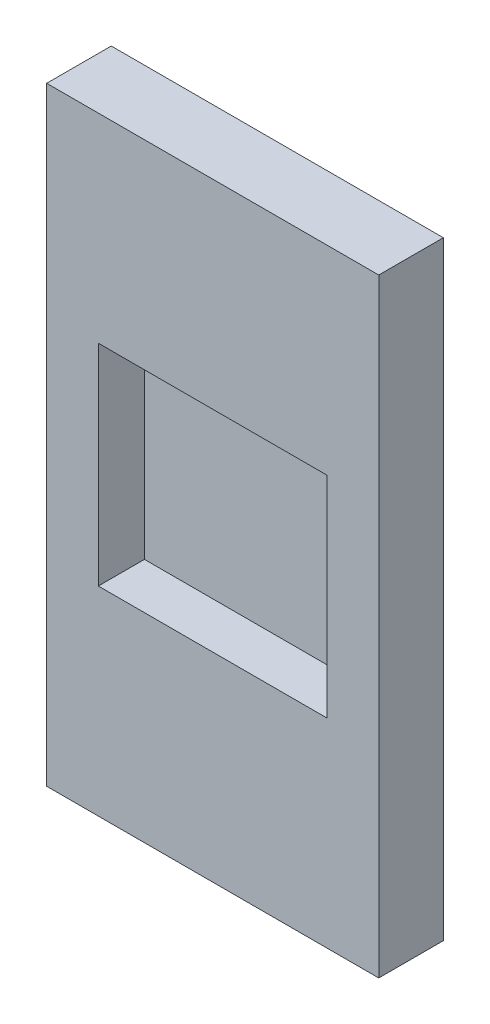
ISO-10303-21;
HEADER;
FILE_DESCRIPTION(('STEP AP214'),'2;1');
FILE_NAME('part.step','',(''),(''),'','','');
FILE_SCHEMA(('AUTOMOTIVE_DESIGN { 1 0 10303 214 1 1 1 1 }'));
ENDSEC;
DATA;
#1=APPLICATION_CONTEXT('core data for automotive mechanical design processes');
#2=APPLICATION_PROTOCOL_DEFINITION('international standard','automotive_design',2000,#1);
#3=PRODUCT_CONTEXT('',#1,'mechanical');
#4=PRODUCT('Part','Part','',(#3));
#5=PRODUCT_RELATED_PRODUCT_CATEGORY('part','',(#4));
#6=PRODUCT_DEFINITION_FORMATION('','',#4);
#7=PRODUCT_DEFINITION_CONTEXT('part definition',#1,'design');
#8=PRODUCT_DEFINITION('design','',#6,#7);
#9=PRODUCT_DEFINITION_SHAPE('','',#8);
#10=(LENGTH_UNIT() NAMED_UNIT(*) SI_UNIT(.MILLI.,.METRE.));
#11=(NAMED_UNIT(*) PLANE_ANGLE_UNIT() SI_UNIT($,.RADIAN.));
#12=(NAMED_UNIT(*) SI_UNIT($,.STERADIAN.) SOLID_ANGLE_UNIT());
#13=UNCERTAINTY_MEASURE_WITH_UNIT(LENGTH_MEASURE(1.E-05),#10,'distance_accuracy_value','');
#14=(GEOMETRIC_REPRESENTATION_CONTEXT(3) GLOBAL_UNCERTAINTY_ASSIGNED_CONTEXT((#13)) GLOBAL_UNIT_ASSIGNED_CONTEXT((#10,
#11,#12)) REPRESENTATION_CONTEXT('',''));
#15=CARTESIAN_POINT('',(0.,0.,0.));
#16=DIRECTION('',(0.,0.,1.));
#17=DIRECTION('',(1.,0.,0.));
#18=AXIS2_PLACEMENT_3D('',#15,#16,#17);
#19=CARTESIAN_POINT('',(9.,-16.5,3.5));
#20=DIRECTION('',(-1.,0.,0.));
#21=DIRECTION('',(0.,0.,1.));
#22=AXIS2_PLACEMENT_3D('',#19,#20,#21);
#23=PLANE('',#22);
#24=DIRECTION('',(0.,1.,0.));
#25=VECTOR('',#24,1.);
#26=CARTESIAN_POINT('',(9.,-16.5,0.));
#27=LINE('',#26,#25);
#28=CARTESIAN_POINT('',(9.,-16.5,0.));
#29=VERTEX_POINT('',#28);
#30=CARTESIAN_POINT('',(9.,16.5,0.));
#31=VERTEX_POINT('',#30);
#32=EDGE_CURVE('E158',#29,#31,#27,.T.);
#33=ORIENTED_EDGE('',*,*,#32,.T.);
#34=DIRECTION('',(0.,0.,-1.));
#35=VECTOR('',#34,1.);
#36=CARTESIAN_POINT('',(9.,16.5,3.5));
#37=LINE('',#36,#35);
#38=CARTESIAN_POINT('',(9.,16.5,3.5));
#39=VERTEX_POINT('',#38);
#40=EDGE_CURVE('E11',#39,#31,#37,.T.);
#41=ORIENTED_EDGE('',*,*,#40,.F.);
#42=DIRECTION('',(0.,1.,0.));
#43=VECTOR('',#42,1.);
#44=CARTESIAN_POINT('',(9.,-16.5,3.5));
#45=LINE('',#44,#43);
#46=CARTESIAN_POINT('',(9.,-16.5,3.5));
#47=VERTEX_POINT('',#46);
#48=EDGE_CURVE('E164',#47,#39,#45,.T.);
#49=ORIENTED_EDGE('',*,*,#48,.F.);
#50=DIRECTION('',(0.,0.,-1.));
#51=VECTOR('',#50,1.);
#52=CARTESIAN_POINT('',(9.,-16.5,3.5));
#53=LINE('',#52,#51);
#54=EDGE_CURVE('E174',#47,#29,#53,.T.);
#55=ORIENTED_EDGE('',*,*,#54,.T.);
#56=EDGE_LOOP('',(#33,#41,#49,#55));
#57=FACE_BOUND('',#56,.T.);
#58=ADVANCED_FACE('F39',(#57),#23,.F.);
#59=CARTESIAN_POINT('',(-9.,16.5,3.5));
#60=DIRECTION('',(0.,-1.,0.));
#61=DIRECTION('',(0.,0.,-1.));
#62=AXIS2_PLACEMENT_3D('',#59,#60,#61);
#63=PLANE('',#62);
#64=DIRECTION('',(-1.,0.,0.));
#65=VECTOR('',#64,1.);
#66=CARTESIAN_POINT('',(-9.,16.5,0.));
#67=LINE('',#66,#65);
#68=CARTESIAN_POINT('',(-9.,16.5,0.));
#69=VERTEX_POINT('',#68);
#70=EDGE_CURVE('E178',#31,#69,#67,.T.);
#71=ORIENTED_EDGE('',*,*,#70,.T.);
#72=DIRECTION('',(0.,0.,-1.));
#73=VECTOR('',#72,1.);
#74=CARTESIAN_POINT('',(-9.,16.5,3.5));
#75=LINE('',#74,#73);
#76=CARTESIAN_POINT('',(-9.,16.5,3.5));
#77=VERTEX_POINT('',#76);
#78=EDGE_CURVE('E47',#77,#69,#75,.T.);
#79=ORIENTED_EDGE('',*,*,#78,.F.);
#80=DIRECTION('',(-1.,0.,0.));
#81=VECTOR('',#80,1.);
#82=CARTESIAN_POINT('',(-9.,16.5,3.5));
#83=LINE('',#82,#81);
#84=EDGE_CURVE('E91',#39,#77,#83,.T.);
#85=ORIENTED_EDGE('',*,*,#84,.F.);
#86=ORIENTED_EDGE('',*,*,#40,.T.);
#87=EDGE_LOOP('',(#71,#79,#85,#86));
#88=FACE_BOUND('',#87,.T.);
#89=ADVANCED_FACE('F213',(#88),#63,.F.);
#90=CARTESIAN_POINT('',(-9.,-16.5,3.5));
#91=DIRECTION('',(1.,0.,0.));
#92=DIRECTION('',(0.,0.,-1.));
#93=AXIS2_PLACEMENT_3D('',#90,#91,#92);
#94=PLANE('',#93);
#95=DIRECTION('',(0.,-1.,0.));
#96=VECTOR('',#95,1.);
#97=CARTESIAN_POINT('',(-9.,-16.5,0.));
#98=LINE('',#97,#96);
#99=CARTESIAN_POINT('',(-9.,-16.5,0.));
#100=VERTEX_POINT('',#99);
#101=EDGE_CURVE('E181',#69,#100,#98,.T.);
#102=ORIENTED_EDGE('',*,*,#101,.T.);
#103=DIRECTION('',(0.,0.,-1.));
#104=VECTOR('',#103,1.);
#105=CARTESIAN_POINT('',(-9.,-16.5,3.5));
#106=LINE('',#105,#104);
#107=CARTESIAN_POINT('',(-9.,-16.5,3.5));
#108=VERTEX_POINT('',#107);
#109=EDGE_CURVE('E188',#108,#100,#106,.T.);
#110=ORIENTED_EDGE('',*,*,#109,.F.);
#111=DIRECTION('',(0.,-1.,0.));
#112=VECTOR('',#111,1.);
#113=CARTESIAN_POINT('',(-9.,-16.5,3.5));
#114=LINE('',#113,#112);
#115=EDGE_CURVE('E169',#77,#108,#114,.T.);
#116=ORIENTED_EDGE('',*,*,#115,.F.);
#117=ORIENTED_EDGE('',*,*,#78,.T.);
#118=EDGE_LOOP('',(#102,#110,#116,#117));
#119=FACE_BOUND('',#118,.T.);
#120=ADVANCED_FACE('F195',(#119),#94,.F.);
#121=CARTESIAN_POINT('',(-9.,-16.5,3.5));
#122=DIRECTION('',(0.,1.,0.));
#123=DIRECTION('',(0.,0.,1.));
#124=AXIS2_PLACEMENT_3D('',#121,#122,#123);
#125=PLANE('',#124);
#126=DIRECTION('',(1.,0.,0.));
#127=VECTOR('',#126,1.);
#128=CARTESIAN_POINT('',(-9.,-16.5,0.));
#129=LINE('',#128,#127);
#130=EDGE_CURVE('E84',#100,#29,#129,.T.);
#131=ORIENTED_EDGE('',*,*,#130,.T.);
#132=ORIENTED_EDGE('',*,*,#54,.F.);
#133=DIRECTION('',(1.,0.,0.));
#134=VECTOR('',#133,1.);
#135=CARTESIAN_POINT('',(-9.,-16.5,3.5));
#136=LINE('',#135,#134);
#137=EDGE_CURVE('E63',#108,#47,#136,.T.);
#138=ORIENTED_EDGE('',*,*,#137,.F.);
#139=ORIENTED_EDGE('',*,*,#109,.T.);
#140=EDGE_LOOP('',(#131,#132,#138,#139));
#141=FACE_BOUND('',#140,.T.);
#142=ADVANCED_FACE('F203',(#141),#125,.F.);
#143=CARTESIAN_POINT('',(0.,0.,3.5));
#144=DIRECTION('',(0.,0.,-1.));
#145=DIRECTION('',(-1.,0.,0.));
#146=AXIS2_PLACEMENT_3D('',#143,#144,#145);
#147=PLANE('',#146);
#148=DIRECTION('',(-1.,0.,0.));
#149=VECTOR('',#148,1.);
#150=CARTESIAN_POINT('',(-6.2,5.7,3.5));
#151=LINE('',#150,#149);
#152=CARTESIAN_POINT('',(6.2,5.7,3.5));
#153=VERTEX_POINT('',#152);
#154=CARTESIAN_POINT('',(-6.2,5.7,3.5));
#155=VERTEX_POINT('',#154);
#156=EDGE_CURVE('E149',#153,#155,#151,.T.);
#157=ORIENTED_EDGE('',*,*,#156,.F.);
#158=DIRECTION('',(0.,1.,0.));
#159=VECTOR('',#158,1.);
#160=CARTESIAN_POINT('',(6.2,-5.7,3.5));
#161=LINE('',#160,#159);
#162=CARTESIAN_POINT('',(6.2,-5.7,3.5));
#163=VERTEX_POINT('',#162);
#164=EDGE_CURVE('E54',#163,#153,#161,.T.);
#165=ORIENTED_EDGE('',*,*,#164,.F.);
#166=DIRECTION('',(1.,0.,0.));
#167=VECTOR('',#166,1.);
#168=CARTESIAN_POINT('',(-6.2,-5.7,3.5));
#169=LINE('',#168,#167);
#170=CARTESIAN_POINT('',(-6.2,-5.7,3.5));
#171=VERTEX_POINT('',#170);
#172=EDGE_CURVE('E136',#171,#163,#169,.T.);
#173=ORIENTED_EDGE('',*,*,#172,.F.);
#174=DIRECTION('',(0.,-1.,0.));
#175=VECTOR('',#174,1.);
#176=CARTESIAN_POINT('',(-6.2,-5.7,3.5));
#177=LINE('',#176,#175);
#178=EDGE_CURVE('E140',#155,#171,#177,.T.);
#179=ORIENTED_EDGE('',*,*,#178,.F.);
#180=EDGE_LOOP('',(#157,#165,#173,#179));
#181=FACE_BOUND('',#180,.T.);
#182=ORIENTED_EDGE('',*,*,#48,.T.);
#183=ORIENTED_EDGE('',*,*,#84,.T.);
#184=ORIENTED_EDGE('',*,*,#115,.T.);
#185=ORIENTED_EDGE('',*,*,#137,.T.);
#186=EDGE_LOOP('',(#182,#183,#184,#185));
#187=FACE_BOUND('',#186,.T.);
#188=ADVANCED_FACE('F205',(#181,#187),#147,.F.);
#189=CARTESIAN_POINT('',(0.,0.,0.));
#190=DIRECTION('',(0.,0.,-1.));
#191=DIRECTION('',(-1.,0.,0.));
#192=AXIS2_PLACEMENT_3D('',#189,#190,#191);
#193=PLANE('',#192);
#194=ORIENTED_EDGE('',*,*,#32,.F.);
#195=ORIENTED_EDGE('',*,*,#130,.F.);
#196=ORIENTED_EDGE('',*,*,#101,.F.);
#197=ORIENTED_EDGE('',*,*,#70,.F.);
#198=EDGE_LOOP('',(#194,#195,#196,#197));
#199=FACE_BOUND('',#198,.T.);
#200=ADVANCED_FACE('F199',(#199),#193,.T.);
#201=CARTESIAN_POINT('',(6.2,-5.7,1.));
#202=DIRECTION('',(1.,0.,0.));
#203=DIRECTION('',(0.,0.,-1.));
#204=AXIS2_PLACEMENT_3D('',#201,#202,#203);
#205=PLANE('',#204);
#206=ORIENTED_EDGE('',*,*,#164,.T.);
#207=DIRECTION('',(0.,0.,1.));
#208=VECTOR('',#207,1.);
#209=CARTESIAN_POINT('',(6.2,5.7,1.));
#210=LINE('',#209,#208);
#211=CARTESIAN_POINT('',(6.2,5.7,1.));
#212=VERTEX_POINT('',#211);
#213=EDGE_CURVE('E111',#212,#153,#210,.T.);
#214=ORIENTED_EDGE('',*,*,#213,.F.);
#215=DIRECTION('',(0.,1.,0.));
#216=VECTOR('',#215,1.);
#217=CARTESIAN_POINT('',(6.2,-5.7,1.));
#218=LINE('',#217,#216);
#219=CARTESIAN_POINT('',(6.2,-5.7,1.));
#220=VERTEX_POINT('',#219);
#221=EDGE_CURVE('E115',#220,#212,#218,.T.);
#222=ORIENTED_EDGE('',*,*,#221,.F.);
#223=DIRECTION('',(0.,0.,1.));
#224=VECTOR('',#223,1.);
#225=CARTESIAN_POINT('',(6.2,-5.7,1.));
#226=LINE('',#225,#224);
#227=EDGE_CURVE('E155',#220,#163,#226,.T.);
#228=ORIENTED_EDGE('',*,*,#227,.T.);
#229=EDGE_LOOP('',(#206,#214,#222,#228));
#230=FACE_BOUND('',#229,.T.);
#231=ADVANCED_FACE('F113',(#230),#205,.F.);
#232=CARTESIAN_POINT('',(-6.2,-5.7,1.));
#233=DIRECTION('',(0.,-1.,0.));
#234=DIRECTION('',(0.,0.,-1.));
#235=AXIS2_PLACEMENT_3D('',#232,#233,#234);
#236=PLANE('',#235);
#237=ORIENTED_EDGE('',*,*,#172,.T.);
#238=ORIENTED_EDGE('',*,*,#227,.F.);
#239=DIRECTION('',(1.,0.,0.));
#240=VECTOR('',#239,1.);
#241=CARTESIAN_POINT('',(-6.2,-5.7,1.));
#242=LINE('',#241,#240);
#243=CARTESIAN_POINT('',(-6.2,-5.7,1.));
#244=VERTEX_POINT('',#243);
#245=EDGE_CURVE('E122',#244,#220,#242,.T.);
#246=ORIENTED_EDGE('',*,*,#245,.F.);
#247=DIRECTION('',(0.,0.,1.));
#248=VECTOR('',#247,1.);
#249=CARTESIAN_POINT('',(-6.2,-5.7,1.));
#250=LINE('',#249,#248);
#251=EDGE_CURVE('E159',#244,#171,#250,.T.);
#252=ORIENTED_EDGE('',*,*,#251,.T.);
#253=EDGE_LOOP('',(#237,#238,#246,#252));
#254=FACE_BOUND('',#253,.T.);
#255=ADVANCED_FACE('F252',(#254),#236,.F.);
#256=CARTESIAN_POINT('',(-6.2,-5.7,1.));
#257=DIRECTION('',(-1.,0.,0.));
#258=DIRECTION('',(0.,0.,1.));
#259=AXIS2_PLACEMENT_3D('',#256,#257,#258);
#260=PLANE('',#259);
#261=ORIENTED_EDGE('',*,*,#178,.T.);
#262=ORIENTED_EDGE('',*,*,#251,.F.);
#263=DIRECTION('',(0.,-1.,0.));
#264=VECTOR('',#263,1.);
#265=CARTESIAN_POINT('',(-6.2,-5.7,1.));
#266=LINE('',#265,#264);
#267=CARTESIAN_POINT('',(-6.2,5.7,1.));
#268=VERTEX_POINT('',#267);
#269=EDGE_CURVE('E131',#268,#244,#266,.T.);
#270=ORIENTED_EDGE('',*,*,#269,.F.);
#271=DIRECTION('',(0.,0.,1.));
#272=VECTOR('',#271,1.);
#273=CARTESIAN_POINT('',(-6.2,5.7,1.));
#274=LINE('',#273,#272);
#275=EDGE_CURVE('E121',#268,#155,#274,.T.);
#276=ORIENTED_EDGE('',*,*,#275,.T.);
#277=EDGE_LOOP('',(#261,#262,#270,#276));
#278=FACE_BOUND('',#277,.T.);
#279=ADVANCED_FACE('F261',(#278),#260,.F.);
#280=CARTESIAN_POINT('',(-6.2,5.7,1.));
#281=DIRECTION('',(0.,1.,0.));
#282=DIRECTION('',(0.,0.,1.));
#283=AXIS2_PLACEMENT_3D('',#280,#281,#282);
#284=PLANE('',#283);
#285=ORIENTED_EDGE('',*,*,#156,.T.);
#286=ORIENTED_EDGE('',*,*,#275,.F.);
#287=DIRECTION('',(-1.,0.,0.));
#288=VECTOR('',#287,1.);
#289=CARTESIAN_POINT('',(-6.2,5.7,1.));
#290=LINE('',#289,#288);
#291=EDGE_CURVE('E125',#212,#268,#290,.T.);
#292=ORIENTED_EDGE('',*,*,#291,.F.);
#293=ORIENTED_EDGE('',*,*,#213,.T.);
#294=EDGE_LOOP('',(#285,#286,#292,#293));
#295=FACE_BOUND('',#294,.T.);
#296=ADVANCED_FACE('F126',(#295),#284,.F.);
#297=CARTESIAN_POINT('',(0.,0.,1.));
#298=DIRECTION('',(0.,0.,-1.));
#299=DIRECTION('',(-1.,0.,0.));
#300=AXIS2_PLACEMENT_3D('',#297,#298,#299);
#301=PLANE('',#300);
#302=ORIENTED_EDGE('',*,*,#221,.T.);
#303=ORIENTED_EDGE('',*,*,#291,.T.);
#304=ORIENTED_EDGE('',*,*,#269,.T.);
#305=ORIENTED_EDGE('',*,*,#245,.T.);
#306=EDGE_LOOP('',(#302,#303,#304,#305));
#307=FACE_BOUND('',#306,.T.);
#308=ADVANCED_FACE('F133',(#307),#301,.F.);
#309=CLOSED_SHELL('',(#58,#89,#120,#142,#188,#200,#231,#255,#279,#296,#308));
#310=MANIFOLD_SOLID_BREP('B2',#309);
#311=ADVANCED_BREP_SHAPE_REPRESENTATION('',(#18,#310),#14);
#312=SHAPE_DEFINITION_REPRESENTATION(#9,#311);
ENDSEC;
END-ISO-10303-21;
